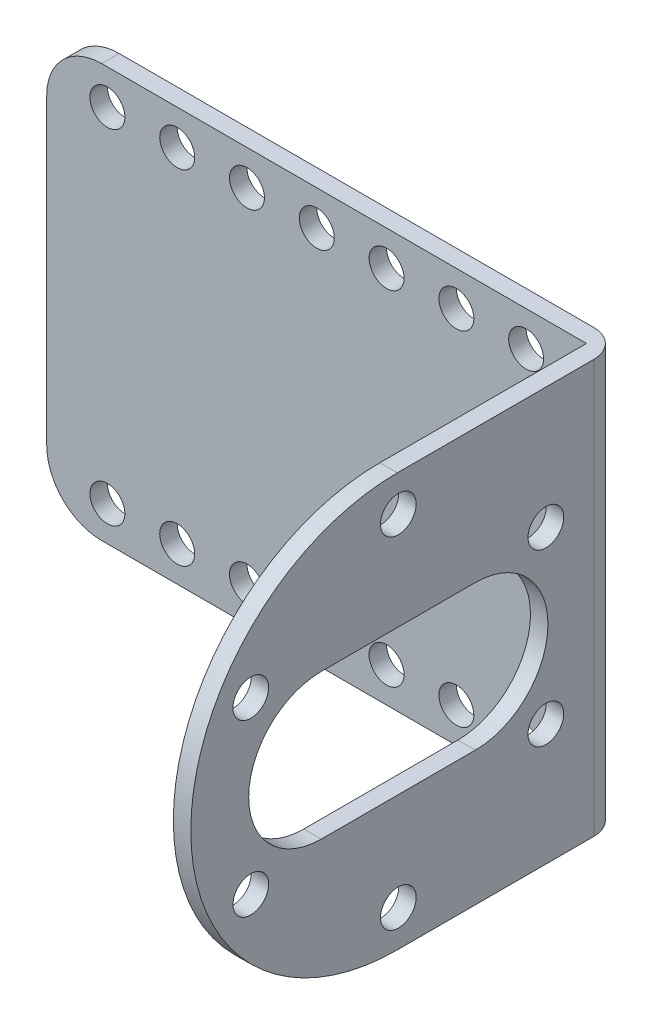
ISO-10303-21;
HEADER;
FILE_DESCRIPTION(('STEP AP214'),'2;1');
FILE_NAME('part.step','',(''),(''),'','','');
FILE_SCHEMA(('AUTOMOTIVE_DESIGN { 1 0 10303 214 1 1 1 1 }'));
ENDSEC;
DATA;
#1=APPLICATION_CONTEXT('core data for automotive mechanical design processes');
#2=APPLICATION_PROTOCOL_DEFINITION('international standard','automotive_design',2000,#1);
#3=PRODUCT_CONTEXT('',#1,'mechanical');
#4=PRODUCT('Part','Part','',(#3));
#5=PRODUCT_RELATED_PRODUCT_CATEGORY('part','',(#4));
#6=PRODUCT_DEFINITION_FORMATION('','',#4);
#7=PRODUCT_DEFINITION_CONTEXT('part definition',#1,'design');
#8=PRODUCT_DEFINITION('design','',#6,#7);
#9=PRODUCT_DEFINITION_SHAPE('','',#8);
#10=(LENGTH_UNIT() NAMED_UNIT(*) SI_UNIT(.MILLI.,.METRE.));
#11=(NAMED_UNIT(*) PLANE_ANGLE_UNIT() SI_UNIT($,.RADIAN.));
#12=(NAMED_UNIT(*) SI_UNIT($,.STERADIAN.) SOLID_ANGLE_UNIT());
#13=UNCERTAINTY_MEASURE_WITH_UNIT(LENGTH_MEASURE(1.E-05),#10,'distance_accuracy_value','');
#14=(GEOMETRIC_REPRESENTATION_CONTEXT(3) GLOBAL_UNCERTAINTY_ASSIGNED_CONTEXT((#13)) GLOBAL_UNIT_ASSIGNED_CONTEXT((#10,
#11,#12)) REPRESENTATION_CONTEXT('',''));
#15=CARTESIAN_POINT('',(0.,0.,0.));
#16=DIRECTION('',(0.,0.,1.));
#17=DIRECTION('',(1.,0.,0.));
#18=AXIS2_PLACEMENT_3D('',#15,#16,#17);
#19=CARTESIAN_POINT('',(18.32,15.62,1.48999999999999));
#20=DIRECTION('',(0.,0.,-1.));
#21=DIRECTION('',(-1.,0.,0.));
#22=AXIS2_PLACEMENT_3D('',#19,#20,#21);
#23=CYLINDRICAL_SURFACE('',#22,1.59);
#24=CARTESIAN_POINT('',(18.32,15.62,1.58999999999999));
#25=DIRECTION('',(0.,0.,-1.));
#26=DIRECTION('',(-1.,0.,0.));
#27=AXIS2_PLACEMENT_3D('',#24,#25,#26);
#28=CIRCLE('',#27,1.59);
#29=CARTESIAN_POINT('',(16.73,15.62,1.58999999999999));
#30=VERTEX_POINT('',#29);
#31=EDGE_CURVE('E9',#30,#30,#28,.T.);
#32=ORIENTED_EDGE('',*,*,#31,.F.);
#33=EDGE_LOOP('',(#32));
#34=FACE_BOUND('',#33,.T.);
#35=CARTESIAN_POINT('',(18.32,15.62,0.));
#36=DIRECTION('',(0.,0.,1.));
#37=DIRECTION('',(-1.,0.,0.));
#38=AXIS2_PLACEMENT_3D('',#35,#36,#37);
#39=CIRCLE('',#38,1.59);
#40=CARTESIAN_POINT('',(16.73,15.62,0.));
#41=VERTEX_POINT('',#40);
#42=EDGE_CURVE('E25',#41,#41,#39,.T.);
#43=ORIENTED_EDGE('',*,*,#42,.F.);
#44=EDGE_LOOP('',(#43));
#45=FACE_BOUND('',#44,.T.);
#46=ADVANCED_FACE('F15',(#34,#45),#23,.F.);
#47=CARTESIAN_POINT('',(-25.3,18.795,0.));
#48=DIRECTION('',(-1.,0.,0.));
#49=DIRECTION('',(0.,0.,1.));
#50=AXIS2_PLACEMENT_3D('',#47,#48,#49);
#51=PLANE('',#50);
#52=DIRECTION('',(0.,0.,1.));
#53=VECTOR('',#52,1.);
#54=CARTESIAN_POINT('',(-25.3,-13.795,0.794999999999997));
#55=LINE('',#54,#53);
#56=CARTESIAN_POINT('',(-25.3,-13.795,0.));
#57=VERTEX_POINT('',#56);
#58=CARTESIAN_POINT('',(-25.3,-13.795,1.58999999999999));
#59=VERTEX_POINT('',#58);
#60=EDGE_CURVE('E282',#57,#59,#55,.T.);
#61=ORIENTED_EDGE('',*,*,#60,.T.);
#62=DIRECTION('',(0.,-1.,0.));
#63=VECTOR('',#62,1.);
#64=CARTESIAN_POINT('',(-25.3,0.,1.58999999999999));
#65=LINE('',#64,#63);
#66=CARTESIAN_POINT('',(-25.3,13.795,1.58999999999999));
#67=VERTEX_POINT('',#66);
#68=EDGE_CURVE('E326',#67,#59,#65,.T.);
#69=ORIENTED_EDGE('',*,*,#68,.F.);
#70=DIRECTION('',(0.,0.,1.));
#71=VECTOR('',#70,1.);
#72=CARTESIAN_POINT('',(-25.3,13.795,0.794999999999996));
#73=LINE('',#72,#71);
#74=CARTESIAN_POINT('',(-25.3,13.795,0.));
#75=VERTEX_POINT('',#74);
#76=EDGE_CURVE('E329',#75,#67,#73,.T.);
#77=ORIENTED_EDGE('',*,*,#76,.F.);
#78=DIRECTION('',(0.,-1.,0.));
#79=VECTOR('',#78,1.);
#80=CARTESIAN_POINT('',(-25.3,0.,0.));
#81=LINE('',#80,#79);
#82=EDGE_CURVE('E34',#75,#57,#81,.T.);
#83=ORIENTED_EDGE('',*,*,#82,.T.);
#84=EDGE_LOOP('',(#61,#69,#77,#83));
#85=FACE_BOUND('',#84,.T.);
#86=ADVANCED_FACE('F341',(#85),#51,.T.);
#87=CARTESIAN_POINT('',(-25.3,18.795,0.));
#88=DIRECTION('',(0.,-1.,0.));
#89=DIRECTION('',(0.,0.,-1.));
#90=AXIS2_PLACEMENT_3D('',#87,#88,#89);
#91=PLANE('',#90);
#92=DIRECTION('',(0.,0.,-1.));
#93=VECTOR('',#92,1.);
#94=CARTESIAN_POINT('',(23.81,18.795,10.9875));
#95=LINE('',#94,#93);
#96=CARTESIAN_POINT('',(23.81,18.795,20.385));
#97=VERTEX_POINT('',#96);
#98=CARTESIAN_POINT('',(23.81,18.795,1.58999999999999));
#99=VERTEX_POINT('',#98);
#100=EDGE_CURVE('E323',#97,#99,#95,.T.);
#101=ORIENTED_EDGE('',*,*,#100,.F.);
#102=DIRECTION('',(-1.,0.,0.));
#103=VECTOR('',#102,1.);
#104=CARTESIAN_POINT('',(24.605,18.795,20.385));
#105=LINE('',#104,#103);
#106=CARTESIAN_POINT('',(25.4,18.795,20.385));
#107=VERTEX_POINT('',#106);
#108=EDGE_CURVE('E307',#107,#97,#105,.T.);
#109=ORIENTED_EDGE('',*,*,#108,.F.);
#110=DIRECTION('',(0.,0.,1.));
#111=VECTOR('',#110,1.);
#112=CARTESIAN_POINT('',(25.4,18.795,11.4425));
#113=LINE('',#112,#111);
#114=CARTESIAN_POINT('',(25.4,18.795,2.5));
#115=VERTEX_POINT('',#114);
#116=EDGE_CURVE('E311',#115,#107,#113,.T.);
#117=ORIENTED_EDGE('',*,*,#116,.F.);
#118=CARTESIAN_POINT('',(22.9,18.795,2.5));
#119=DIRECTION('',(0.,-1.,0.));
#120=DIRECTION('',(0.,0.,-1.));
#121=AXIS2_PLACEMENT_3D('',#118,#119,#120);
#122=CIRCLE('',#121,2.5);
#123=CARTESIAN_POINT('',(22.9,18.795,0.));
#124=VERTEX_POINT('',#123);
#125=EDGE_CURVE('E314',#124,#115,#122,.T.);
#126=ORIENTED_EDGE('',*,*,#125,.F.);
#127=DIRECTION('',(-1.,0.,0.));
#128=VECTOR('',#127,1.);
#129=CARTESIAN_POINT('',(1.3,18.795,0.));
#130=LINE('',#129,#128);
#131=CARTESIAN_POINT('',(-20.3,18.795,0.));
#132=VERTEX_POINT('',#131);
#133=EDGE_CURVE('E271',#124,#132,#130,.T.);
#134=ORIENTED_EDGE('',*,*,#133,.T.);
#135=DIRECTION('',(0.,0.,1.));
#136=VECTOR('',#135,1.);
#137=CARTESIAN_POINT('',(-20.3,18.795,0.794999999999998));
#138=LINE('',#137,#136);
#139=CARTESIAN_POINT('',(-20.3,18.795,1.58999999999999));
#140=VERTEX_POINT('',#139);
#141=EDGE_CURVE('E319',#132,#140,#138,.T.);
#142=ORIENTED_EDGE('',*,*,#141,.T.);
#143=DIRECTION('',(-1.,0.,0.));
#144=VECTOR('',#143,1.);
#145=CARTESIAN_POINT('',(1.755,18.795,1.58999999999999));
#146=LINE('',#145,#144);
#147=EDGE_CURVE('E317',#99,#140,#146,.T.);
#148=ORIENTED_EDGE('',*,*,#147,.F.);
#149=EDGE_LOOP('',(#101,#109,#117,#126,#134,#142,#148));
#150=FACE_BOUND('',#149,.T.);
#151=ADVANCED_FACE('F348',(#150),#91,.F.);
#152=CARTESIAN_POINT('',(25.4,-18.795,0.));
#153=DIRECTION('',(0.,1.,0.));
#154=DIRECTION('',(0.,0.,1.));
#155=AXIS2_PLACEMENT_3D('',#152,#153,#154);
#156=PLANE('',#155);
#157=DIRECTION('',(0.,0.,1.));
#158=VECTOR('',#157,1.);
#159=CARTESIAN_POINT('',(25.4,-18.795,11.4425));
#160=LINE('',#159,#158);
#161=CARTESIAN_POINT('',(25.4,-18.795,2.5));
#162=VERTEX_POINT('',#161);
#163=CARTESIAN_POINT('',(25.4,-18.795,20.385));
#164=VERTEX_POINT('',#163);
#165=EDGE_CURVE('E158',#162,#164,#160,.T.);
#166=ORIENTED_EDGE('',*,*,#165,.T.);
#167=DIRECTION('',(1.,0.,0.));
#168=VECTOR('',#167,1.);
#169=CARTESIAN_POINT('',(24.605,-18.795,20.385));
#170=LINE('',#169,#168);
#171=CARTESIAN_POINT('',(23.81,-18.795,20.385));
#172=VERTEX_POINT('',#171);
#173=EDGE_CURVE('E293',#172,#164,#170,.T.);
#174=ORIENTED_EDGE('',*,*,#173,.F.);
#175=DIRECTION('',(0.,0.,-1.));
#176=VECTOR('',#175,1.);
#177=CARTESIAN_POINT('',(23.81,-18.795,10.9875));
#178=LINE('',#177,#176);
#179=CARTESIAN_POINT('',(23.81,-18.795,1.59));
#180=VERTEX_POINT('',#179);
#181=EDGE_CURVE('E186',#172,#180,#178,.T.);
#182=ORIENTED_EDGE('',*,*,#181,.T.);
#183=DIRECTION('',(1.,0.,0.));
#184=VECTOR('',#183,1.);
#185=CARTESIAN_POINT('',(1.755,-18.795,1.59));
#186=LINE('',#185,#184);
#187=CARTESIAN_POINT('',(-20.3,-18.795,1.59));
#188=VERTEX_POINT('',#187);
#189=EDGE_CURVE('E296',#188,#180,#186,.T.);
#190=ORIENTED_EDGE('',*,*,#189,.F.);
#191=DIRECTION('',(0.,0.,1.));
#192=VECTOR('',#191,1.);
#193=CARTESIAN_POINT('',(-20.3,-18.795,0.794999999999997));
#194=LINE('',#193,#192);
#195=CARTESIAN_POINT('',(-20.3,-18.795,0.));
#196=VERTEX_POINT('',#195);
#197=EDGE_CURVE('E300',#196,#188,#194,.T.);
#198=ORIENTED_EDGE('',*,*,#197,.F.);
#199=DIRECTION('',(1.,0.,0.));
#200=VECTOR('',#199,1.);
#201=CARTESIAN_POINT('',(1.3,-18.795,0.));
#202=LINE('',#201,#200);
#203=CARTESIAN_POINT('',(22.9,-18.795,0.));
#204=VERTEX_POINT('',#203);
#205=EDGE_CURVE('E277',#196,#204,#202,.T.);
#206=ORIENTED_EDGE('',*,*,#205,.T.);
#207=CARTESIAN_POINT('',(22.9,-18.795,2.5));
#208=DIRECTION('',(0.,1.,0.));
#209=DIRECTION('',(0.,0.,1.));
#210=AXIS2_PLACEMENT_3D('',#207,#208,#209);
#211=CIRCLE('',#210,2.5);
#212=EDGE_CURVE('E303',#162,#204,#211,.T.);
#213=ORIENTED_EDGE('',*,*,#212,.F.);
#214=EDGE_LOOP('',(#166,#174,#182,#190,#198,#206,#213));
#215=FACE_BOUND('',#214,.T.);
#216=ADVANCED_FACE('F354',(#215),#156,.F.);
#217=CARTESIAN_POINT('',(18.32,-15.62,1.48999999999999));
#218=DIRECTION('',(0.,0.,-1.));
#219=DIRECTION('',(-1.,0.,0.));
#220=AXIS2_PLACEMENT_3D('',#217,#218,#219);
#221=CYLINDRICAL_SURFACE('',#220,1.59);
#222=CARTESIAN_POINT('',(18.32,-15.62,1.58999999999999));
#223=DIRECTION('',(0.,0.,-1.));
#224=DIRECTION('',(-1.,0.,0.));
#225=AXIS2_PLACEMENT_3D('',#222,#223,#224);
#226=CIRCLE('',#225,1.59);
#227=CARTESIAN_POINT('',(16.73,-15.62,1.58999999999999));
#228=VERTEX_POINT('',#227);
#229=EDGE_CURVE('E290',#228,#228,#226,.T.);
#230=ORIENTED_EDGE('',*,*,#229,.F.);
#231=EDGE_LOOP('',(#230));
#232=FACE_BOUND('',#231,.T.);
#233=CARTESIAN_POINT('',(18.32,-15.62,0.));
#234=DIRECTION('',(0.,0.,1.));
#235=DIRECTION('',(-1.,0.,0.));
#236=AXIS2_PLACEMENT_3D('',#233,#234,#235);
#237=CIRCLE('',#236,1.59);
#238=CARTESIAN_POINT('',(16.73,-15.62,0.));
#239=VERTEX_POINT('',#238);
#240=EDGE_CURVE('E281',#239,#239,#237,.T.);
#241=ORIENTED_EDGE('',*,*,#240,.F.);
#242=EDGE_LOOP('',(#241));
#243=FACE_BOUND('',#242,.T.);
#244=ADVANCED_FACE('F358',(#232,#243),#221,.F.);
#245=CARTESIAN_POINT('',(2.55,0.,20.385));
#246=DIRECTION('',(-1.,0.,0.));
#247=DIRECTION('',(0.,0.,1.));
#248=AXIS2_PLACEMENT_3D('',#245,#246,#247);
#249=CYLINDRICAL_SURFACE('',#248,18.795);
#250=ORIENTED_EDGE('',*,*,#173,.T.);
#251=CARTESIAN_POINT('',(25.4,0.,20.385));
#252=DIRECTION('',(-1.,0.,0.));
#253=DIRECTION('',(0.,0.,1.));
#254=AXIS2_PLACEMENT_3D('',#251,#252,#253);
#255=CIRCLE('',#254,18.795);
#256=EDGE_CURVE('E162',#164,#107,#255,.T.);
#257=ORIENTED_EDGE('',*,*,#256,.T.);
#258=ORIENTED_EDGE('',*,*,#108,.T.);
#259=CARTESIAN_POINT('',(23.81,0.,20.385));
#260=DIRECTION('',(1.,0.,0.));
#261=DIRECTION('',(0.,0.,1.));
#262=AXIS2_PLACEMENT_3D('',#259,#260,#261);
#263=CIRCLE('',#262,18.795);
#264=EDGE_CURVE('E191',#97,#172,#263,.T.);
#265=ORIENTED_EDGE('',*,*,#264,.T.);
#266=EDGE_LOOP('',(#250,#257,#258,#265));
#267=FACE_BOUND('',#266,.T.);
#268=ADVANCED_FACE('F362',(#267),#249,.T.);
#269=CARTESIAN_POINT('',(22.9,0.,2.5));
#270=DIRECTION('',(0.,1.,0.));
#271=DIRECTION('',(0.,0.,1.));
#272=AXIS2_PLACEMENT_3D('',#269,#270,#271);
#273=CYLINDRICAL_SURFACE('',#272,2.5);
#274=DIRECTION('',(0.,1.,0.));
#275=VECTOR('',#274,1.);
#276=CARTESIAN_POINT('',(22.9,0.,0.));
#277=LINE('',#276,#275);
#278=EDGE_CURVE('E267',#204,#124,#277,.T.);
#279=ORIENTED_EDGE('',*,*,#278,.T.);
#280=ORIENTED_EDGE('',*,*,#125,.T.);
#281=DIRECTION('',(0.,1.,0.));
#282=VECTOR('',#281,1.);
#283=CARTESIAN_POINT('',(25.4,0.,2.5));
#284=LINE('',#283,#282);
#285=EDGE_CURVE('E278',#162,#115,#284,.T.);
#286=ORIENTED_EDGE('',*,*,#285,.F.);
#287=ORIENTED_EDGE('',*,*,#212,.T.);
#288=EDGE_LOOP('',(#279,#280,#286,#287));
#289=FACE_BOUND('',#288,.T.);
#290=ADVANCED_FACE('F366',(#289),#273,.T.);
#291=CARTESIAN_POINT('',(-20.3,-13.795,19.59));
#292=DIRECTION('',(0.,0.,1.));
#293=DIRECTION('',(1.,0.,0.));
#294=AXIS2_PLACEMENT_3D('',#291,#292,#293);
#295=CYLINDRICAL_SURFACE('',#294,5.);
#296=ORIENTED_EDGE('',*,*,#197,.T.);
#297=CARTESIAN_POINT('',(-20.3,-13.795,1.59));
#298=DIRECTION('',(0.,0.,-1.));
#299=DIRECTION('',(1.,0.,0.));
#300=AXIS2_PLACEMENT_3D('',#297,#298,#299);
#301=CIRCLE('',#300,5.);
#302=EDGE_CURVE('E240',#188,#59,#301,.T.);
#303=ORIENTED_EDGE('',*,*,#302,.T.);
#304=ORIENTED_EDGE('',*,*,#60,.F.);
#305=CARTESIAN_POINT('',(-20.3,-13.795,0.));
#306=DIRECTION('',(0.,0.,1.));
#307=DIRECTION('',(1.,0.,0.));
#308=AXIS2_PLACEMENT_3D('',#305,#306,#307);
#309=CIRCLE('',#308,5.);
#310=EDGE_CURVE('E274',#57,#196,#309,.T.);
#311=ORIENTED_EDGE('',*,*,#310,.T.);
#312=EDGE_LOOP('',(#296,#303,#304,#311));
#313=FACE_BOUND('',#312,.T.);
#314=ADVANCED_FACE('F370',(#313),#295,.T.);
#315=CARTESIAN_POINT('',(-20.3,13.795,19.59));
#316=DIRECTION('',(0.,0.,1.));
#317=DIRECTION('',(1.,0.,0.));
#318=AXIS2_PLACEMENT_3D('',#315,#316,#317);
#319=CYLINDRICAL_SURFACE('',#318,5.);
#320=ORIENTED_EDGE('',*,*,#76,.T.);
#321=CARTESIAN_POINT('',(-20.3,13.795,1.58999999999999));
#322=DIRECTION('',(0.,0.,-1.));
#323=DIRECTION('',(1.,0.,0.));
#324=AXIS2_PLACEMENT_3D('',#321,#322,#323);
#325=CIRCLE('',#324,5.);
#326=EDGE_CURVE('E239',#67,#140,#325,.T.);
#327=ORIENTED_EDGE('',*,*,#326,.T.);
#328=ORIENTED_EDGE('',*,*,#141,.F.);
#329=CARTESIAN_POINT('',(-20.3,13.795,0.));
#330=DIRECTION('',(0.,0.,1.));
#331=DIRECTION('',(1.,0.,0.));
#332=AXIS2_PLACEMENT_3D('',#329,#330,#331);
#333=CIRCLE('',#332,5.);
#334=EDGE_CURVE('E268',#132,#75,#333,.T.);
#335=ORIENTED_EDGE('',*,*,#334,.T.);
#336=EDGE_LOOP('',(#320,#327,#328,#335));
#337=FACE_BOUND('',#336,.T.);
#338=ADVANCED_FACE('F374',(#337),#319,.T.);
#339=CARTESIAN_POINT('',(0.,0.,0.));
#340=DIRECTION('',(0.,0.,1.));
#341=DIRECTION('',(1.,0.,0.));
#342=AXIS2_PLACEMENT_3D('',#339,#340,#341);
#343=PLANE('',#342);
#344=ORIENTED_EDGE('',*,*,#133,.F.);
#345=ORIENTED_EDGE('',*,*,#278,.F.);
#346=ORIENTED_EDGE('',*,*,#205,.F.);
#347=ORIENTED_EDGE('',*,*,#310,.F.);
#348=ORIENTED_EDGE('',*,*,#82,.F.);
#349=ORIENTED_EDGE('',*,*,#334,.F.);
#350=EDGE_LOOP('',(#344,#345,#346,#347,#348,#349));
#351=FACE_BOUND('',#350,.T.);
#352=CARTESIAN_POINT('',(11.97,-15.62,0.));
#353=DIRECTION('',(0.,0.,1.));
#354=DIRECTION('',(1.,0.,0.));
#355=AXIS2_PLACEMENT_3D('',#352,#353,#354);
#356=CIRCLE('',#355,1.59);
#357=CARTESIAN_POINT('',(13.56,-15.62,0.));
#358=VERTEX_POINT('',#357);
#359=EDGE_CURVE('E212',#358,#358,#356,.T.);
#360=ORIENTED_EDGE('',*,*,#359,.T.);
#361=EDGE_LOOP('',(#360));
#362=FACE_BOUND('',#361,.T.);
#363=CARTESIAN_POINT('',(11.97,15.62,0.));
#364=DIRECTION('',(0.,0.,1.));
#365=DIRECTION('',(1.,0.,0.));
#366=AXIS2_PLACEMENT_3D('',#363,#364,#365);
#367=CIRCLE('',#366,1.59);
#368=CARTESIAN_POINT('',(13.56,15.62,0.));
#369=VERTEX_POINT('',#368);
#370=EDGE_CURVE('E232',#369,#369,#367,.T.);
#371=ORIENTED_EDGE('',*,*,#370,.T.);
#372=EDGE_LOOP('',(#371));
#373=FACE_BOUND('',#372,.T.);
#374=ORIENTED_EDGE('',*,*,#42,.T.);
#375=EDGE_LOOP('',(#374));
#376=FACE_BOUND('',#375,.T.);
#377=ORIENTED_EDGE('',*,*,#240,.T.);
#378=EDGE_LOOP('',(#377));
#379=FACE_BOUND('',#378,.T.);
#380=CARTESIAN_POINT('',(5.62,15.62,0.));
#381=DIRECTION('',(0.,0.,1.));
#382=DIRECTION('',(1.,0.,0.));
#383=AXIS2_PLACEMENT_3D('',#380,#381,#382);
#384=CIRCLE('',#383,1.59);
#385=CARTESIAN_POINT('',(7.21,15.62,0.));
#386=VERTEX_POINT('',#385);
#387=EDGE_CURVE('E228',#386,#386,#384,.T.);
#388=ORIENTED_EDGE('',*,*,#387,.T.);
#389=EDGE_LOOP('',(#388));
#390=FACE_BOUND('',#389,.T.);
#391=CARTESIAN_POINT('',(-0.729999999999997,15.62,0.));
#392=DIRECTION('',(0.,0.,1.));
#393=DIRECTION('',(1.,0.,0.));
#394=AXIS2_PLACEMENT_3D('',#391,#392,#393);
#395=CIRCLE('',#394,1.59);
#396=CARTESIAN_POINT('',(0.860000000000003,15.62,0.));
#397=VERTEX_POINT('',#396);
#398=EDGE_CURVE('E224',#397,#397,#395,.T.);
#399=ORIENTED_EDGE('',*,*,#398,.T.);
#400=EDGE_LOOP('',(#399));
#401=FACE_BOUND('',#400,.T.);
#402=CARTESIAN_POINT('',(-7.08,15.62,0.));
#403=DIRECTION('',(0.,0.,1.));
#404=DIRECTION('',(1.,0.,0.));
#405=AXIS2_PLACEMENT_3D('',#402,#403,#404);
#406=CIRCLE('',#405,1.59);
#407=CARTESIAN_POINT('',(-5.49,15.62,0.));
#408=VERTEX_POINT('',#407);
#409=EDGE_CURVE('E220',#408,#408,#406,.T.);
#410=ORIENTED_EDGE('',*,*,#409,.T.);
#411=EDGE_LOOP('',(#410));
#412=FACE_BOUND('',#411,.T.);
#413=CARTESIAN_POINT('',(-13.43,15.62,0.));
#414=DIRECTION('',(0.,0.,1.));
#415=DIRECTION('',(1.,0.,0.));
#416=AXIS2_PLACEMENT_3D('',#413,#414,#415);
#417=CIRCLE('',#416,1.59);
#418=CARTESIAN_POINT('',(-11.84,15.62,0.));
#419=VERTEX_POINT('',#418);
#420=EDGE_CURVE('E216',#419,#419,#417,.T.);
#421=ORIENTED_EDGE('',*,*,#420,.T.);
#422=EDGE_LOOP('',(#421));
#423=FACE_BOUND('',#422,.T.);
#424=CARTESIAN_POINT('',(-19.78,15.62,0.));
#425=DIRECTION('',(0.,0.,1.));
#426=DIRECTION('',(1.,0.,0.));
#427=AXIS2_PLACEMENT_3D('',#424,#425,#426);
#428=CIRCLE('',#427,1.59);
#429=CARTESIAN_POINT('',(-18.19,15.62,0.));
#430=VERTEX_POINT('',#429);
#431=EDGE_CURVE('E211',#430,#430,#428,.T.);
#432=ORIENTED_EDGE('',*,*,#431,.T.);
#433=EDGE_LOOP('',(#432));
#434=FACE_BOUND('',#433,.T.);
#435=CARTESIAN_POINT('',(5.62,-15.62,0.));
#436=DIRECTION('',(0.,0.,1.));
#437=DIRECTION('',(1.,0.,0.));
#438=AXIS2_PLACEMENT_3D('',#435,#436,#437);
#439=CIRCLE('',#438,1.59);
#440=CARTESIAN_POINT('',(7.21,-15.62,0.));
#441=VERTEX_POINT('',#440);
#442=EDGE_CURVE('E207',#441,#441,#439,.T.);
#443=ORIENTED_EDGE('',*,*,#442,.T.);
#444=EDGE_LOOP('',(#443));
#445=FACE_BOUND('',#444,.T.);
#446=CARTESIAN_POINT('',(-0.729999999999997,-15.62,0.));
#447=DIRECTION('',(0.,0.,1.));
#448=DIRECTION('',(1.,0.,0.));
#449=AXIS2_PLACEMENT_3D('',#446,#447,#448);
#450=CIRCLE('',#449,1.59);
#451=CARTESIAN_POINT('',(0.860000000000003,-15.62,0.));
#452=VERTEX_POINT('',#451);
#453=EDGE_CURVE('E203',#452,#452,#450,.T.);
#454=ORIENTED_EDGE('',*,*,#453,.T.);
#455=EDGE_LOOP('',(#454));
#456=FACE_BOUND('',#455,.T.);
#457=CARTESIAN_POINT('',(-7.08,-15.62,0.));
#458=DIRECTION('',(0.,0.,1.));
#459=DIRECTION('',(1.,0.,0.));
#460=AXIS2_PLACEMENT_3D('',#457,#458,#459);
#461=CIRCLE('',#460,1.59);
#462=CARTESIAN_POINT('',(-5.49,-15.62,0.));
#463=VERTEX_POINT('',#462);
#464=EDGE_CURVE('E199',#463,#463,#461,.T.);
#465=ORIENTED_EDGE('',*,*,#464,.T.);
#466=EDGE_LOOP('',(#465));
#467=FACE_BOUND('',#466,.T.);
#468=CARTESIAN_POINT('',(-13.43,-15.62,0.));
#469=DIRECTION('',(0.,0.,1.));
#470=DIRECTION('',(1.,0.,0.));
#471=AXIS2_PLACEMENT_3D('',#468,#469,#470);
#472=CIRCLE('',#471,1.59);
#473=CARTESIAN_POINT('',(-11.84,-15.62,0.));
#474=VERTEX_POINT('',#473);
#475=EDGE_CURVE('E195',#474,#474,#472,.T.);
#476=ORIENTED_EDGE('',*,*,#475,.T.);
#477=EDGE_LOOP('',(#476));
#478=FACE_BOUND('',#477,.T.);
#479=CARTESIAN_POINT('',(-19.78,-15.62,0.));
#480=DIRECTION('',(0.,0.,1.));
#481=DIRECTION('',(1.,0.,0.));
#482=AXIS2_PLACEMENT_3D('',#479,#480,#481);
#483=CIRCLE('',#482,1.59);
#484=CARTESIAN_POINT('',(-18.19,-15.62,0.));
#485=VERTEX_POINT('',#484);
#486=EDGE_CURVE('E190',#485,#485,#483,.T.);
#487=ORIENTED_EDGE('',*,*,#486,.T.);
#488=EDGE_LOOP('',(#487));
#489=FACE_BOUND('',#488,.T.);
#490=ADVANCED_FACE('F337',(#351,#362,#373,#376,#379,#390,#401,#412,#423,#434,#445,#456,#467,
#478,#489),#343,.F.);
#491=CARTESIAN_POINT('',(-46.19,18.795,1.58999999999999));
#492=DIRECTION('',(0.,0.,-1.));
#493=DIRECTION('',(-1.,0.,0.));
#494=AXIS2_PLACEMENT_3D('',#491,#492,#493);
#495=PLANE('',#494);
#496=ORIENTED_EDGE('',*,*,#68,.T.);
#497=ORIENTED_EDGE('',*,*,#302,.F.);
#498=ORIENTED_EDGE('',*,*,#189,.T.);
#499=DIRECTION('',(0.,-1.,0.));
#500=VECTOR('',#499,1.);
#501=CARTESIAN_POINT('',(23.81,0.,1.58999999999999));
#502=LINE('',#501,#500);
#503=EDGE_CURVE('E236',#99,#180,#502,.T.);
#504=ORIENTED_EDGE('',*,*,#503,.F.);
#505=ORIENTED_EDGE('',*,*,#147,.T.);
#506=ORIENTED_EDGE('',*,*,#326,.F.);
#507=EDGE_LOOP('',(#496,#497,#498,#504,#505,#506));
#508=FACE_BOUND('',#507,.T.);
#509=CARTESIAN_POINT('',(11.97,-15.62,1.58999999999999));
#510=DIRECTION('',(0.,0.,-1.));
#511=DIRECTION('',(-1.,0.,0.));
#512=AXIS2_PLACEMENT_3D('',#509,#510,#511);
#513=CIRCLE('',#512,1.59);
#514=CARTESIAN_POINT('',(10.38,-15.62,1.58999999999999));
#515=VERTEX_POINT('',#514);
#516=EDGE_CURVE('E233',#515,#515,#513,.T.);
#517=ORIENTED_EDGE('',*,*,#516,.T.);
#518=EDGE_LOOP('',(#517));
#519=FACE_BOUND('',#518,.T.);
#520=CARTESIAN_POINT('',(11.97,15.62,1.58999999999999));
#521=DIRECTION('',(0.,0.,-1.));
#522=DIRECTION('',(-1.,0.,0.));
#523=AXIS2_PLACEMENT_3D('',#520,#521,#522);
#524=CIRCLE('',#523,1.59);
#525=CARTESIAN_POINT('',(10.38,15.62,1.58999999999999));
#526=VERTEX_POINT('',#525);
#527=EDGE_CURVE('E229',#526,#526,#524,.T.);
#528=ORIENTED_EDGE('',*,*,#527,.T.);
#529=EDGE_LOOP('',(#528));
#530=FACE_BOUND('',#529,.T.);
#531=ORIENTED_EDGE('',*,*,#31,.T.);
#532=EDGE_LOOP('',(#531));
#533=FACE_BOUND('',#532,.T.);
#534=ORIENTED_EDGE('',*,*,#229,.T.);
#535=EDGE_LOOP('',(#534));
#536=FACE_BOUND('',#535,.T.);
#537=CARTESIAN_POINT('',(5.62,15.62,1.58999999999999));
#538=DIRECTION('',(0.,0.,-1.));
#539=DIRECTION('',(-1.,0.,0.));
#540=AXIS2_PLACEMENT_3D('',#537,#538,#539);
#541=CIRCLE('',#540,1.59);
#542=CARTESIAN_POINT('',(4.03,15.62,1.58999999999999));
#543=VERTEX_POINT('',#542);
#544=EDGE_CURVE('E225',#543,#543,#541,.T.);
#545=ORIENTED_EDGE('',*,*,#544,.T.);
#546=EDGE_LOOP('',(#545));
#547=FACE_BOUND('',#546,.T.);
#548=CARTESIAN_POINT('',(-0.730000000000004,15.62,1.58999999999999));
#549=DIRECTION('',(0.,0.,-1.));
#550=DIRECTION('',(-1.,0.,0.));
#551=AXIS2_PLACEMENT_3D('',#548,#549,#550);
#552=CIRCLE('',#551,1.59);
#553=CARTESIAN_POINT('',(-2.32000000000001,15.62,1.58999999999999));
#554=VERTEX_POINT('',#553);
#555=EDGE_CURVE('E221',#554,#554,#552,.T.);
#556=ORIENTED_EDGE('',*,*,#555,.T.);
#557=EDGE_LOOP('',(#556));
#558=FACE_BOUND('',#557,.T.);
#559=CARTESIAN_POINT('',(-7.08,15.62,1.58999999999999));
#560=DIRECTION('',(0.,0.,-1.));
#561=DIRECTION('',(-1.,0.,0.));
#562=AXIS2_PLACEMENT_3D('',#559,#560,#561);
#563=CIRCLE('',#562,1.59);
#564=CARTESIAN_POINT('',(-8.67,15.62,1.58999999999999));
#565=VERTEX_POINT('',#564);
#566=EDGE_CURVE('E217',#565,#565,#563,.T.);
#567=ORIENTED_EDGE('',*,*,#566,.T.);
#568=EDGE_LOOP('',(#567));
#569=FACE_BOUND('',#568,.T.);
#570=CARTESIAN_POINT('',(-13.43,15.62,1.58999999999999));
#571=DIRECTION('',(0.,0.,-1.));
#572=DIRECTION('',(-1.,0.,0.));
#573=AXIS2_PLACEMENT_3D('',#570,#571,#572);
#574=CIRCLE('',#573,1.59);
#575=CARTESIAN_POINT('',(-15.02,15.62,1.58999999999999));
#576=VERTEX_POINT('',#575);
#577=EDGE_CURVE('E213',#576,#576,#574,.T.);
#578=ORIENTED_EDGE('',*,*,#577,.T.);
#579=EDGE_LOOP('',(#578));
#580=FACE_BOUND('',#579,.T.);
#581=CARTESIAN_POINT('',(-19.78,15.62,1.58999999999999));
#582=DIRECTION('',(0.,0.,-1.));
#583=DIRECTION('',(-1.,0.,0.));
#584=AXIS2_PLACEMENT_3D('',#581,#582,#583);
#585=CIRCLE('',#584,1.59);
#586=CARTESIAN_POINT('',(-21.37,15.62,1.58999999999999));
#587=VERTEX_POINT('',#586);
#588=EDGE_CURVE('E208',#587,#587,#585,.T.);
#589=ORIENTED_EDGE('',*,*,#588,.T.);
#590=EDGE_LOOP('',(#589));
#591=FACE_BOUND('',#590,.T.);
#592=CARTESIAN_POINT('',(5.62,-15.62,1.58999999999999));
#593=DIRECTION('',(0.,0.,-1.));
#594=DIRECTION('',(-1.,0.,0.));
#595=AXIS2_PLACEMENT_3D('',#592,#593,#594);
#596=CIRCLE('',#595,1.59);
#597=CARTESIAN_POINT('',(4.03,-15.62,1.58999999999999));
#598=VERTEX_POINT('',#597);
#599=EDGE_CURVE('E204',#598,#598,#596,.T.);
#600=ORIENTED_EDGE('',*,*,#599,.T.);
#601=EDGE_LOOP('',(#600));
#602=FACE_BOUND('',#601,.T.);
#603=CARTESIAN_POINT('',(-0.730000000000004,-15.62,1.58999999999999));
#604=DIRECTION('',(0.,0.,-1.));
#605=DIRECTION('',(-1.,0.,0.));
#606=AXIS2_PLACEMENT_3D('',#603,#604,#605);
#607=CIRCLE('',#606,1.59);
#608=CARTESIAN_POINT('',(-2.32000000000001,-15.62,1.58999999999999));
#609=VERTEX_POINT('',#608);
#610=EDGE_CURVE('E200',#609,#609,#607,.T.);
#611=ORIENTED_EDGE('',*,*,#610,.T.);
#612=EDGE_LOOP('',(#611));
#613=FACE_BOUND('',#612,.T.);
#614=CARTESIAN_POINT('',(-7.08,-15.62,1.58999999999999));
#615=DIRECTION('',(0.,0.,-1.));
#616=DIRECTION('',(-1.,0.,0.));
#617=AXIS2_PLACEMENT_3D('',#614,#615,#616);
#618=CIRCLE('',#617,1.59);
#619=CARTESIAN_POINT('',(-8.67,-15.62,1.58999999999999));
#620=VERTEX_POINT('',#619);
#621=EDGE_CURVE('E196',#620,#620,#618,.T.);
#622=ORIENTED_EDGE('',*,*,#621,.T.);
#623=EDGE_LOOP('',(#622));
#624=FACE_BOUND('',#623,.T.);
#625=CARTESIAN_POINT('',(-13.43,-15.62,1.58999999999999));
#626=DIRECTION('',(0.,0.,-1.));
#627=DIRECTION('',(-1.,0.,0.));
#628=AXIS2_PLACEMENT_3D('',#625,#626,#627);
#629=CIRCLE('',#628,1.59);
#630=CARTESIAN_POINT('',(-15.02,-15.62,1.58999999999999));
#631=VERTEX_POINT('',#630);
#632=EDGE_CURVE('E192',#631,#631,#629,.T.);
#633=ORIENTED_EDGE('',*,*,#632,.T.);
#634=EDGE_LOOP('',(#633));
#635=FACE_BOUND('',#634,.T.);
#636=CARTESIAN_POINT('',(-19.78,-15.62,1.58999999999999));
#637=DIRECTION('',(0.,0.,-1.));
#638=DIRECTION('',(-1.,0.,0.));
#639=AXIS2_PLACEMENT_3D('',#636,#637,#638);
#640=CIRCLE('',#639,1.59);
#641=CARTESIAN_POINT('',(-21.37,-15.62,1.58999999999999));
#642=VERTEX_POINT('',#641);
#643=EDGE_CURVE('E187',#642,#642,#640,.T.);
#644=ORIENTED_EDGE('',*,*,#643,.T.);
#645=EDGE_LOOP('',(#644));
#646=FACE_BOUND('',#645,.T.);
#647=ADVANCED_FACE('F381',(#508,#519,#530,#533,#536,#547,#558,#569,#580,#591,#602,#613,#624,
#635,#646),#495,.F.);
#648=CARTESIAN_POINT('',(11.97,15.62,1.48999999999999));
#649=DIRECTION('',(0.,0.,-1.));
#650=DIRECTION('',(-1.,0.,0.));
#651=AXIS2_PLACEMENT_3D('',#648,#649,#650);
#652=CYLINDRICAL_SURFACE('',#651,1.59);
#653=ORIENTED_EDGE('',*,*,#527,.F.);
#654=EDGE_LOOP('',(#653));
#655=FACE_BOUND('',#654,.T.);
#656=ORIENTED_EDGE('',*,*,#370,.F.);
#657=EDGE_LOOP('',(#656));
#658=FACE_BOUND('',#657,.T.);
#659=ADVANCED_FACE('F385',(#655,#658),#652,.F.);
#660=CARTESIAN_POINT('',(5.62,15.62,1.48999999999999));
#661=DIRECTION('',(0.,0.,-1.));
#662=DIRECTION('',(-1.,0.,0.));
#663=AXIS2_PLACEMENT_3D('',#660,#661,#662);
#664=CYLINDRICAL_SURFACE('',#663,1.59);
#665=ORIENTED_EDGE('',*,*,#544,.F.);
#666=EDGE_LOOP('',(#665));
#667=FACE_BOUND('',#666,.T.);
#668=ORIENTED_EDGE('',*,*,#387,.F.);
#669=EDGE_LOOP('',(#668));
#670=FACE_BOUND('',#669,.T.);
#671=ADVANCED_FACE('F389',(#667,#670),#664,.F.);
#672=CARTESIAN_POINT('',(-0.729999999999997,15.62,1.48999999999999));
#673=DIRECTION('',(0.,0.,-1.));
#674=DIRECTION('',(-1.,0.,0.));
#675=AXIS2_PLACEMENT_3D('',#672,#673,#674);
#676=CYLINDRICAL_SURFACE('',#675,1.59);
#677=ORIENTED_EDGE('',*,*,#555,.F.);
#678=EDGE_LOOP('',(#677));
#679=FACE_BOUND('',#678,.T.);
#680=ORIENTED_EDGE('',*,*,#398,.F.);
#681=EDGE_LOOP('',(#680));
#682=FACE_BOUND('',#681,.T.);
#683=ADVANCED_FACE('F393',(#679,#682),#676,.F.);
#684=CARTESIAN_POINT('',(-7.08,15.62,1.48999999999999));
#685=DIRECTION('',(0.,0.,-1.));
#686=DIRECTION('',(-1.,0.,0.));
#687=AXIS2_PLACEMENT_3D('',#684,#685,#686);
#688=CYLINDRICAL_SURFACE('',#687,1.59);
#689=ORIENTED_EDGE('',*,*,#566,.F.);
#690=EDGE_LOOP('',(#689));
#691=FACE_BOUND('',#690,.T.);
#692=ORIENTED_EDGE('',*,*,#409,.F.);
#693=EDGE_LOOP('',(#692));
#694=FACE_BOUND('',#693,.T.);
#695=ADVANCED_FACE('F397',(#691,#694),#688,.F.);
#696=CARTESIAN_POINT('',(-13.43,15.62,1.48999999999999));
#697=DIRECTION('',(0.,0.,-1.));
#698=DIRECTION('',(-1.,0.,0.));
#699=AXIS2_PLACEMENT_3D('',#696,#697,#698);
#700=CYLINDRICAL_SURFACE('',#699,1.59);
#701=ORIENTED_EDGE('',*,*,#577,.F.);
#702=EDGE_LOOP('',(#701));
#703=FACE_BOUND('',#702,.T.);
#704=ORIENTED_EDGE('',*,*,#420,.F.);
#705=EDGE_LOOP('',(#704));
#706=FACE_BOUND('',#705,.T.);
#707=ADVANCED_FACE('F401',(#703,#706),#700,.F.);
#708=CARTESIAN_POINT('',(-19.78,15.62,1.48999999999999));
#709=DIRECTION('',(0.,0.,-1.));
#710=DIRECTION('',(-1.,0.,0.));
#711=AXIS2_PLACEMENT_3D('',#708,#709,#710);
#712=CYLINDRICAL_SURFACE('',#711,1.59);
#713=ORIENTED_EDGE('',*,*,#588,.F.);
#714=EDGE_LOOP('',(#713));
#715=FACE_BOUND('',#714,.T.);
#716=ORIENTED_EDGE('',*,*,#431,.F.);
#717=EDGE_LOOP('',(#716));
#718=FACE_BOUND('',#717,.T.);
#719=ADVANCED_FACE('F405',(#715,#718),#712,.F.);
#720=CARTESIAN_POINT('',(11.97,-15.62,1.48999999999999));
#721=DIRECTION('',(0.,0.,-1.));
#722=DIRECTION('',(-1.,0.,0.));
#723=AXIS2_PLACEMENT_3D('',#720,#721,#722);
#724=CYLINDRICAL_SURFACE('',#723,1.59);
#725=ORIENTED_EDGE('',*,*,#516,.F.);
#726=EDGE_LOOP('',(#725));
#727=FACE_BOUND('',#726,.T.);
#728=ORIENTED_EDGE('',*,*,#359,.F.);
#729=EDGE_LOOP('',(#728));
#730=FACE_BOUND('',#729,.T.);
#731=ADVANCED_FACE('F409',(#727,#730),#724,.F.);
#732=CARTESIAN_POINT('',(5.62,-15.62,1.48999999999999));
#733=DIRECTION('',(0.,0.,-1.));
#734=DIRECTION('',(-1.,0.,0.));
#735=AXIS2_PLACEMENT_3D('',#732,#733,#734);
#736=CYLINDRICAL_SURFACE('',#735,1.59);
#737=ORIENTED_EDGE('',*,*,#599,.F.);
#738=EDGE_LOOP('',(#737));
#739=FACE_BOUND('',#738,.T.);
#740=ORIENTED_EDGE('',*,*,#442,.F.);
#741=EDGE_LOOP('',(#740));
#742=FACE_BOUND('',#741,.T.);
#743=ADVANCED_FACE('F413',(#739,#742),#736,.F.);
#744=CARTESIAN_POINT('',(-0.729999999999997,-15.62,1.48999999999999));
#745=DIRECTION('',(0.,0.,-1.));
#746=DIRECTION('',(-1.,0.,0.));
#747=AXIS2_PLACEMENT_3D('',#744,#745,#746);
#748=CYLINDRICAL_SURFACE('',#747,1.59);
#749=ORIENTED_EDGE('',*,*,#610,.F.);
#750=EDGE_LOOP('',(#749));
#751=FACE_BOUND('',#750,.T.);
#752=ORIENTED_EDGE('',*,*,#453,.F.);
#753=EDGE_LOOP('',(#752));
#754=FACE_BOUND('',#753,.T.);
#755=ADVANCED_FACE('F417',(#751,#754),#748,.F.);
#756=CARTESIAN_POINT('',(-7.08,-15.62,1.48999999999999));
#757=DIRECTION('',(0.,0.,-1.));
#758=DIRECTION('',(-1.,0.,0.));
#759=AXIS2_PLACEMENT_3D('',#756,#757,#758);
#760=CYLINDRICAL_SURFACE('',#759,1.59);
#761=ORIENTED_EDGE('',*,*,#621,.F.);
#762=EDGE_LOOP('',(#761));
#763=FACE_BOUND('',#762,.T.);
#764=ORIENTED_EDGE('',*,*,#464,.F.);
#765=EDGE_LOOP('',(#764));
#766=FACE_BOUND('',#765,.T.);
#767=ADVANCED_FACE('F421',(#763,#766),#760,.F.);
#768=CARTESIAN_POINT('',(-13.43,-15.62,1.48999999999999));
#769=DIRECTION('',(0.,0.,-1.));
#770=DIRECTION('',(-1.,0.,0.));
#771=AXIS2_PLACEMENT_3D('',#768,#769,#770);
#772=CYLINDRICAL_SURFACE('',#771,1.59);
#773=ORIENTED_EDGE('',*,*,#632,.F.);
#774=EDGE_LOOP('',(#773));
#775=FACE_BOUND('',#774,.T.);
#776=ORIENTED_EDGE('',*,*,#475,.F.);
#777=EDGE_LOOP('',(#776));
#778=FACE_BOUND('',#777,.T.);
#779=ADVANCED_FACE('F425',(#775,#778),#772,.F.);
#780=CARTESIAN_POINT('',(-19.78,-15.62,1.48999999999999));
#781=DIRECTION('',(0.,0.,-1.));
#782=DIRECTION('',(-1.,0.,0.));
#783=AXIS2_PLACEMENT_3D('',#780,#781,#782);
#784=CYLINDRICAL_SURFACE('',#783,1.59);
#785=ORIENTED_EDGE('',*,*,#643,.F.);
#786=EDGE_LOOP('',(#785));
#787=FACE_BOUND('',#786,.T.);
#788=ORIENTED_EDGE('',*,*,#486,.F.);
#789=EDGE_LOOP('',(#788));
#790=FACE_BOUND('',#789,.T.);
#791=ADVANCED_FACE('F429',(#787,#790),#784,.F.);
#792=CARTESIAN_POINT('',(23.81,18.795,50.));
#793=DIRECTION('',(-1.,0.,0.));
#794=DIRECTION('',(0.,0.,1.));
#795=AXIS2_PLACEMENT_3D('',#792,#793,#794);
#796=PLANE('',#795);
#797=ORIENTED_EDGE('',*,*,#264,.F.);
#798=ORIENTED_EDGE('',*,*,#100,.T.);
#799=ORIENTED_EDGE('',*,*,#503,.T.);
#800=ORIENTED_EDGE('',*,*,#181,.F.);
#801=EDGE_LOOP('',(#797,#798,#799,#800));
#802=FACE_BOUND('',#801,.T.);
#803=CARTESIAN_POINT('',(23.81,15.5,20.3));
#804=DIRECTION('',(-1.,0.,0.));
#805=DIRECTION('',(0.,0.,1.));
#806=AXIS2_PLACEMENT_3D('',#803,#804,#805);
#807=CIRCLE('',#806,1.625);
#808=CARTESIAN_POINT('',(23.81,15.5,21.925));
#809=VERTEX_POINT('',#808);
#810=EDGE_CURVE('E183',#809,#809,#807,.T.);
#811=ORIENTED_EDGE('',*,*,#810,.F.);
#812=EDGE_LOOP('',(#811));
#813=FACE_BOUND('',#812,.T.);
#814=CARTESIAN_POINT('',(23.81,7.75,6.8766062413412));
#815=DIRECTION('',(-1.,0.,0.));
#816=DIRECTION('',(0.,0.,1.));
#817=AXIS2_PLACEMENT_3D('',#814,#815,#816);
#818=CIRCLE('',#817,1.625);
#819=CARTESIAN_POINT('',(23.81,7.75,8.5016062413412));
#820=VERTEX_POINT('',#819);
#821=EDGE_CURVE('E180',#820,#820,#818,.T.);
#822=ORIENTED_EDGE('',*,*,#821,.F.);
#823=EDGE_LOOP('',(#822));
#824=FACE_BOUND('',#823,.T.);
#825=CARTESIAN_POINT('',(23.81,-7.75,6.8766062413412));
#826=DIRECTION('',(-1.,0.,0.));
#827=DIRECTION('',(0.,0.,1.));
#828=AXIS2_PLACEMENT_3D('',#825,#826,#827);
#829=CIRCLE('',#828,1.625);
#830=CARTESIAN_POINT('',(23.81,-7.75,8.5016062413412));
#831=VERTEX_POINT('',#830);
#832=EDGE_CURVE('E177',#831,#831,#829,.T.);
#833=ORIENTED_EDGE('',*,*,#832,.F.);
#834=EDGE_LOOP('',(#833));
#835=FACE_BOUND('',#834,.T.);
#836=CARTESIAN_POINT('',(23.81,-15.5,20.3));
#837=DIRECTION('',(-1.,0.,0.));
#838=DIRECTION('',(0.,0.,1.));
#839=AXIS2_PLACEMENT_3D('',#836,#837,#838);
#840=CIRCLE('',#839,1.625);
#841=CARTESIAN_POINT('',(23.81,-15.5,21.925));
#842=VERTEX_POINT('',#841);
#843=EDGE_CURVE('E174',#842,#842,#840,.T.);
#844=ORIENTED_EDGE('',*,*,#843,.F.);
#845=EDGE_LOOP('',(#844));
#846=FACE_BOUND('',#845,.T.);
#847=CARTESIAN_POINT('',(23.81,-7.75000000000001,33.7233937586588));
#848=DIRECTION('',(-1.,0.,0.));
#849=DIRECTION('',(0.,0.,1.));
#850=AXIS2_PLACEMENT_3D('',#847,#848,#849);
#851=CIRCLE('',#850,1.625);
#852=CARTESIAN_POINT('',(23.81,-7.75000000000001,35.3483937586588));
#853=VERTEX_POINT('',#852);
#854=EDGE_CURVE('E171',#853,#853,#851,.T.);
#855=ORIENTED_EDGE('',*,*,#854,.F.);
#856=EDGE_LOOP('',(#855));
#857=FACE_BOUND('',#856,.T.);
#858=CARTESIAN_POINT('',(23.81,7.74999999999999,33.7233937586588));
#859=DIRECTION('',(-1.,0.,0.));
#860=DIRECTION('',(0.,0.,1.));
#861=AXIS2_PLACEMENT_3D('',#858,#859,#860);
#862=CIRCLE('',#861,1.625);
#863=CARTESIAN_POINT('',(23.81,7.74999999999999,35.3483937586588));
#864=VERTEX_POINT('',#863);
#865=EDGE_CURVE('E168',#864,#864,#862,.T.);
#866=ORIENTED_EDGE('',*,*,#865,.F.);
#867=EDGE_LOOP('',(#866));
#868=FACE_BOUND('',#867,.T.);
#869=DIRECTION('',(0.,0.,1.));
#870=VECTOR('',#869,1.);
#871=CARTESIAN_POINT('',(23.81,-6.605,20.3));
#872=LINE('',#871,#870);
#873=CARTESIAN_POINT('',(23.81,-6.605,13.29));
#874=VERTEX_POINT('',#873);
#875=CARTESIAN_POINT('',(23.81,-6.605,27.31));
#876=VERTEX_POINT('',#875);
#877=EDGE_CURVE('E133',#874,#876,#872,.T.);
#878=ORIENTED_EDGE('',*,*,#877,.F.);
#879=CARTESIAN_POINT('',(23.81,0.,13.29));
#880=DIRECTION('',(-1.,0.,0.));
#881=DIRECTION('',(0.,0.,1.));
#882=AXIS2_PLACEMENT_3D('',#879,#880,#881);
#883=CIRCLE('',#882,6.605);
#884=CARTESIAN_POINT('',(23.81,6.605,13.29));
#885=VERTEX_POINT('',#884);
#886=EDGE_CURVE('E159',#885,#874,#883,.T.);
#887=ORIENTED_EDGE('',*,*,#886,.F.);
#888=DIRECTION('',(0.,0.,-1.));
#889=VECTOR('',#888,1.);
#890=CARTESIAN_POINT('',(23.81,6.605,20.3));
#891=LINE('',#890,#889);
#892=CARTESIAN_POINT('',(23.81,6.605,27.31));
#893=VERTEX_POINT('',#892);
#894=EDGE_CURVE('E161',#893,#885,#891,.T.);
#895=ORIENTED_EDGE('',*,*,#894,.F.);
#896=CARTESIAN_POINT('',(23.81,0.,27.31));
#897=DIRECTION('',(-1.,0.,0.));
#898=DIRECTION('',(0.,0.,1.));
#899=AXIS2_PLACEMENT_3D('',#896,#897,#898);
#900=CIRCLE('',#899,6.605);
#901=EDGE_CURVE('E165',#876,#893,#900,.T.);
#902=ORIENTED_EDGE('',*,*,#901,.F.);
#903=EDGE_LOOP('',(#878,#887,#895,#902));
#904=FACE_BOUND('',#903,.T.);
#905=ADVANCED_FACE('F433',(#802,#813,#824,#835,#846,#857,#868,#904),#796,.T.);
#906=CARTESIAN_POINT('',(25.4,-18.795,0.));
#907=DIRECTION('',(1.,0.,0.));
#908=DIRECTION('',(0.,0.,-1.));
#909=AXIS2_PLACEMENT_3D('',#906,#907,#908);
#910=PLANE('',#909);
#911=ORIENTED_EDGE('',*,*,#256,.F.);
#912=ORIENTED_EDGE('',*,*,#165,.F.);
#913=ORIENTED_EDGE('',*,*,#285,.T.);
#914=ORIENTED_EDGE('',*,*,#116,.T.);
#915=EDGE_LOOP('',(#911,#912,#913,#914));
#916=FACE_BOUND('',#915,.T.);
#917=CARTESIAN_POINT('',(25.4,15.5,20.3));
#918=DIRECTION('',(1.,0.,0.));
#919=DIRECTION('',(0.,0.,-1.));
#920=AXIS2_PLACEMENT_3D('',#917,#918,#919);
#921=CIRCLE('',#920,1.625);
#922=CARTESIAN_POINT('',(25.4,15.5,18.675));
#923=VERTEX_POINT('',#922);
#924=EDGE_CURVE('E155',#923,#923,#921,.T.);
#925=ORIENTED_EDGE('',*,*,#924,.F.);
#926=EDGE_LOOP('',(#925));
#927=FACE_BOUND('',#926,.T.);
#928=CARTESIAN_POINT('',(25.4,7.75,6.8766062413412));
#929=DIRECTION('',(1.,0.,0.));
#930=DIRECTION('',(0.,0.,-1.));
#931=AXIS2_PLACEMENT_3D('',#928,#929,#930);
#932=CIRCLE('',#931,1.625);
#933=CARTESIAN_POINT('',(25.4,7.75,5.2516062413412));
#934=VERTEX_POINT('',#933);
#935=EDGE_CURVE('E152',#934,#934,#932,.T.);
#936=ORIENTED_EDGE('',*,*,#935,.F.);
#937=EDGE_LOOP('',(#936));
#938=FACE_BOUND('',#937,.T.);
#939=CARTESIAN_POINT('',(25.4,-7.75,6.8766062413412));
#940=DIRECTION('',(1.,0.,0.));
#941=DIRECTION('',(0.,0.,-1.));
#942=AXIS2_PLACEMENT_3D('',#939,#940,#941);
#943=CIRCLE('',#942,1.625);
#944=CARTESIAN_POINT('',(25.4,-7.75,5.2516062413412));
#945=VERTEX_POINT('',#944);
#946=EDGE_CURVE('E149',#945,#945,#943,.T.);
#947=ORIENTED_EDGE('',*,*,#946,.F.);
#948=EDGE_LOOP('',(#947));
#949=FACE_BOUND('',#948,.T.);
#950=CARTESIAN_POINT('',(25.4,-15.5,20.3));
#951=DIRECTION('',(1.,0.,0.));
#952=DIRECTION('',(0.,0.,-1.));
#953=AXIS2_PLACEMENT_3D('',#950,#951,#952);
#954=CIRCLE('',#953,1.625);
#955=CARTESIAN_POINT('',(25.4,-15.5,18.675));
#956=VERTEX_POINT('',#955);
#957=EDGE_CURVE('E146',#956,#956,#954,.T.);
#958=ORIENTED_EDGE('',*,*,#957,.F.);
#959=EDGE_LOOP('',(#958));
#960=FACE_BOUND('',#959,.T.);
#961=CARTESIAN_POINT('',(25.4,-7.75000000000001,33.7233937586588));
#962=DIRECTION('',(1.,0.,0.));
#963=DIRECTION('',(0.,0.,-1.));
#964=AXIS2_PLACEMENT_3D('',#961,#962,#963);
#965=CIRCLE('',#964,1.625);
#966=CARTESIAN_POINT('',(25.4,-7.75000000000001,32.0983937586588));
#967=VERTEX_POINT('',#966);
#968=EDGE_CURVE('E143',#967,#967,#965,.T.);
#969=ORIENTED_EDGE('',*,*,#968,.F.);
#970=EDGE_LOOP('',(#969));
#971=FACE_BOUND('',#970,.T.);
#972=CARTESIAN_POINT('',(25.4,7.74999999999999,33.7233937586588));
#973=DIRECTION('',(1.,0.,0.));
#974=DIRECTION('',(0.,0.,-1.));
#975=AXIS2_PLACEMENT_3D('',#972,#973,#974);
#976=CIRCLE('',#975,1.625);
#977=CARTESIAN_POINT('',(25.4,7.74999999999999,32.0983937586588));
#978=VERTEX_POINT('',#977);
#979=EDGE_CURVE('E140',#978,#978,#976,.T.);
#980=ORIENTED_EDGE('',*,*,#979,.F.);
#981=EDGE_LOOP('',(#980));
#982=FACE_BOUND('',#981,.T.);
#983=CARTESIAN_POINT('',(25.4,0.,13.29));
#984=DIRECTION('',(1.,0.,0.));
#985=DIRECTION('',(0.,0.,-1.));
#986=AXIS2_PLACEMENT_3D('',#983,#984,#985);
#987=CIRCLE('',#986,6.605);
#988=CARTESIAN_POINT('',(25.4,-6.605,13.29));
#989=VERTEX_POINT('',#988);
#990=CARTESIAN_POINT('',(25.4,6.605,13.29));
#991=VERTEX_POINT('',#990);
#992=EDGE_CURVE('E113',#989,#991,#987,.T.);
#993=ORIENTED_EDGE('',*,*,#992,.F.);
#994=DIRECTION('',(0.,0.,-1.));
#995=VECTOR('',#994,1.);
#996=CARTESIAN_POINT('',(25.4,-6.605,20.3));
#997=LINE('',#996,#995);
#998=CARTESIAN_POINT('',(25.4,-6.605,27.31));
#999=VERTEX_POINT('',#998);
#1000=EDGE_CURVE('E110',#999,#989,#997,.T.);
#1001=ORIENTED_EDGE('',*,*,#1000,.F.);
#1002=CARTESIAN_POINT('',(25.4,0.,27.31));
#1003=DIRECTION('',(1.,0.,0.));
#1004=DIRECTION('',(0.,0.,-1.));
#1005=AXIS2_PLACEMENT_3D('',#1002,#1003,#1004);
#1006=CIRCLE('',#1005,6.605);
#1007=CARTESIAN_POINT('',(25.4,6.605,27.31));
#1008=VERTEX_POINT('',#1007);
#1009=EDGE_CURVE('E107',#1008,#999,#1006,.T.);
#1010=ORIENTED_EDGE('',*,*,#1009,.F.);
#1011=DIRECTION('',(0.,0.,1.));
#1012=VECTOR('',#1011,1.);
#1013=CARTESIAN_POINT('',(25.4,6.605,20.3));
#1014=LINE('',#1013,#1012);
#1015=EDGE_CURVE('E128',#991,#1008,#1014,.T.);
#1016=ORIENTED_EDGE('',*,*,#1015,.F.);
#1017=EDGE_LOOP('',(#993,#1001,#1010,#1016));
#1018=FACE_BOUND('',#1017,.T.);
#1019=ADVANCED_FACE('F111',(#916,#927,#938,#949,#960,#971,#982,#1018),#910,.T.);
#1020=CARTESIAN_POINT('',(43.4,-7.75000000000001,33.7233937586588));
#1021=DIRECTION('',(-1.,0.,0.));
#1022=DIRECTION('',(0.,0.,1.));
#1023=AXIS2_PLACEMENT_3D('',#1020,#1021,#1022);
#1024=CYLINDRICAL_SURFACE('',#1023,1.625);
#1025=ORIENTED_EDGE('',*,*,#968,.T.);
#1026=EDGE_LOOP('',(#1025));
#1027=FACE_BOUND('',#1026,.T.);
#1028=ORIENTED_EDGE('',*,*,#854,.T.);
#1029=EDGE_LOOP('',(#1028));
#1030=FACE_BOUND('',#1029,.T.);
#1031=ADVANCED_FACE('F440',(#1027,#1030),#1024,.F.);
#1032=CARTESIAN_POINT('',(43.4,7.75,6.8766062413412));
#1033=DIRECTION('',(-1.,0.,0.));
#1034=DIRECTION('',(0.,0.,1.));
#1035=AXIS2_PLACEMENT_3D('',#1032,#1033,#1034);
#1036=CYLINDRICAL_SURFACE('',#1035,1.625);
#1037=ORIENTED_EDGE('',*,*,#935,.T.);
#1038=EDGE_LOOP('',(#1037));
#1039=FACE_BOUND('',#1038,.T.);
#1040=ORIENTED_EDGE('',*,*,#821,.T.);
#1041=EDGE_LOOP('',(#1040));
#1042=FACE_BOUND('',#1041,.T.);
#1043=ADVANCED_FACE('F444',(#1039,#1042),#1036,.F.);
#1044=CARTESIAN_POINT('',(43.4,7.74999999999999,33.7233937586588));
#1045=DIRECTION('',(-1.,0.,0.));
#1046=DIRECTION('',(0.,0.,1.));
#1047=AXIS2_PLACEMENT_3D('',#1044,#1045,#1046);
#1048=CYLINDRICAL_SURFACE('',#1047,1.625);
#1049=ORIENTED_EDGE('',*,*,#979,.T.);
#1050=EDGE_LOOP('',(#1049));
#1051=FACE_BOUND('',#1050,.T.);
#1052=ORIENTED_EDGE('',*,*,#865,.T.);
#1053=EDGE_LOOP('',(#1052));
#1054=FACE_BOUND('',#1053,.T.);
#1055=ADVANCED_FACE('F448',(#1051,#1054),#1048,.F.);
#1056=CARTESIAN_POINT('',(43.4,-7.75,6.8766062413412));
#1057=DIRECTION('',(-1.,0.,0.));
#1058=DIRECTION('',(0.,0.,1.));
#1059=AXIS2_PLACEMENT_3D('',#1056,#1057,#1058);
#1060=CYLINDRICAL_SURFACE('',#1059,1.625);
#1061=ORIENTED_EDGE('',*,*,#946,.T.);
#1062=EDGE_LOOP('',(#1061));
#1063=FACE_BOUND('',#1062,.T.);
#1064=ORIENTED_EDGE('',*,*,#832,.T.);
#1065=EDGE_LOOP('',(#1064));
#1066=FACE_BOUND('',#1065,.T.);
#1067=ADVANCED_FACE('F452',(#1063,#1066),#1060,.F.);
#1068=CARTESIAN_POINT('',(23.81,-6.605,27.31));
#1069=DIRECTION('',(0.,-1.,0.));
#1070=DIRECTION('',(0.,0.,-1.));
#1071=AXIS2_PLACEMENT_3D('',#1068,#1069,#1070);
#1072=PLANE('',#1071);
#1073=DIRECTION('',(1.,0.,0.));
#1074=VECTOR('',#1073,1.);
#1075=CARTESIAN_POINT('',(24.605,-6.605,27.31));
#1076=LINE('',#1075,#1074);
#1077=EDGE_CURVE('E125',#876,#999,#1076,.T.);
#1078=ORIENTED_EDGE('',*,*,#1077,.T.);
#1079=ORIENTED_EDGE('',*,*,#1000,.T.);
#1080=DIRECTION('',(1.,0.,0.));
#1081=VECTOR('',#1080,1.);
#1082=CARTESIAN_POINT('',(24.605,-6.605,13.29));
#1083=LINE('',#1082,#1081);
#1084=EDGE_CURVE('E118',#874,#989,#1083,.T.);
#1085=ORIENTED_EDGE('',*,*,#1084,.F.);
#1086=ORIENTED_EDGE('',*,*,#877,.T.);
#1087=EDGE_LOOP('',(#1078,#1079,#1085,#1086));
#1088=FACE_BOUND('',#1087,.T.);
#1089=ADVANCED_FACE('F131',(#1088),#1072,.F.);
#1090=CARTESIAN_POINT('',(43.4,0.,27.31));
#1091=DIRECTION('',(-1.,0.,0.));
#1092=DIRECTION('',(0.,0.,1.));
#1093=AXIS2_PLACEMENT_3D('',#1090,#1091,#1092);
#1094=CYLINDRICAL_SURFACE('',#1093,6.605);
#1095=DIRECTION('',(1.,0.,0.));
#1096=VECTOR('',#1095,1.);
#1097=CARTESIAN_POINT('',(43.4,6.605,27.31));
#1098=LINE('',#1097,#1096);
#1099=EDGE_CURVE('E127',#893,#1008,#1098,.T.);
#1100=ORIENTED_EDGE('',*,*,#1099,.T.);
#1101=ORIENTED_EDGE('',*,*,#1009,.T.);
#1102=ORIENTED_EDGE('',*,*,#1077,.F.);
#1103=ORIENTED_EDGE('',*,*,#901,.T.);
#1104=EDGE_LOOP('',(#1100,#1101,#1102,#1103));
#1105=FACE_BOUND('',#1104,.T.);
#1106=ADVANCED_FACE('F123',(#1105),#1094,.F.);
#1107=CARTESIAN_POINT('',(43.4,0.,13.29));
#1108=DIRECTION('',(-1.,0.,0.));
#1109=DIRECTION('',(0.,0.,1.));
#1110=AXIS2_PLACEMENT_3D('',#1107,#1108,#1109);
#1111=CYLINDRICAL_SURFACE('',#1110,6.605);
#1112=ORIENTED_EDGE('',*,*,#1084,.T.);
#1113=ORIENTED_EDGE('',*,*,#992,.T.);
#1114=DIRECTION('',(1.,0.,0.));
#1115=VECTOR('',#1114,1.);
#1116=CARTESIAN_POINT('',(43.4,6.605,13.29));
#1117=LINE('',#1116,#1115);
#1118=EDGE_CURVE('E19',#885,#991,#1117,.T.);
#1119=ORIENTED_EDGE('',*,*,#1118,.F.);
#1120=ORIENTED_EDGE('',*,*,#886,.T.);
#1121=EDGE_LOOP('',(#1112,#1113,#1119,#1120));
#1122=FACE_BOUND('',#1121,.T.);
#1123=ADVANCED_FACE('F461',(#1122),#1111,.F.);
#1124=CARTESIAN_POINT('',(23.81,6.605,13.29));
#1125=DIRECTION('',(0.,1.,0.));
#1126=DIRECTION('',(0.,0.,1.));
#1127=AXIS2_PLACEMENT_3D('',#1124,#1125,#1126);
#1128=PLANE('',#1127);
#1129=ORIENTED_EDGE('',*,*,#1118,.T.);
#1130=ORIENTED_EDGE('',*,*,#1015,.T.);
#1131=ORIENTED_EDGE('',*,*,#1099,.F.);
#1132=ORIENTED_EDGE('',*,*,#894,.T.);
#1133=EDGE_LOOP('',(#1129,#1130,#1131,#1132));
#1134=FACE_BOUND('',#1133,.T.);
#1135=ADVANCED_FACE('F464',(#1134),#1128,.F.);
#1136=CARTESIAN_POINT('',(43.4,-15.5,20.3));
#1137=DIRECTION('',(-1.,0.,0.));
#1138=DIRECTION('',(0.,0.,1.));
#1139=AXIS2_PLACEMENT_3D('',#1136,#1137,#1138);
#1140=CYLINDRICAL_SURFACE('',#1139,1.625);
#1141=ORIENTED_EDGE('',*,*,#957,.T.);
#1142=EDGE_LOOP('',(#1141));
#1143=FACE_BOUND('',#1142,.T.);
#1144=ORIENTED_EDGE('',*,*,#843,.T.);
#1145=EDGE_LOOP('',(#1144));
#1146=FACE_BOUND('',#1145,.T.);
#1147=ADVANCED_FACE('F467',(#1143,#1146),#1140,.F.);
#1148=CARTESIAN_POINT('',(43.4,15.5,20.3));
#1149=DIRECTION('',(-1.,0.,0.));
#1150=DIRECTION('',(0.,0.,1.));
#1151=AXIS2_PLACEMENT_3D('',#1148,#1149,#1150);
#1152=CYLINDRICAL_SURFACE('',#1151,1.625);
#1153=ORIENTED_EDGE('',*,*,#924,.T.);
#1154=EDGE_LOOP('',(#1153));
#1155=FACE_BOUND('',#1154,.T.);
#1156=ORIENTED_EDGE('',*,*,#810,.T.);
#1157=EDGE_LOOP('',(#1156));
#1158=FACE_BOUND('',#1157,.T.);
#1159=ADVANCED_FACE('F17',(#1155,#1158),#1152,.F.);
#1160=CLOSED_SHELL('',(#46,#86,#151,#216,#244,#268,#290,#314,#338,#490,#647,#659,#671,#683,#695,
#707,#719,#731,#743,#755,#767,#779,#791,#905,#1019,#1031,#1043,#1055,#1067,#1089,#1106,#1123,
#1135,#1147,#1159));
#1161=MANIFOLD_SOLID_BREP('B1',#1160);
#1162=ADVANCED_BREP_SHAPE_REPRESENTATION('',(#18,#1161),#14);
#1163=SHAPE_DEFINITION_REPRESENTATION(#9,#1162);
ENDSEC;
END-ISO-10303-21;
